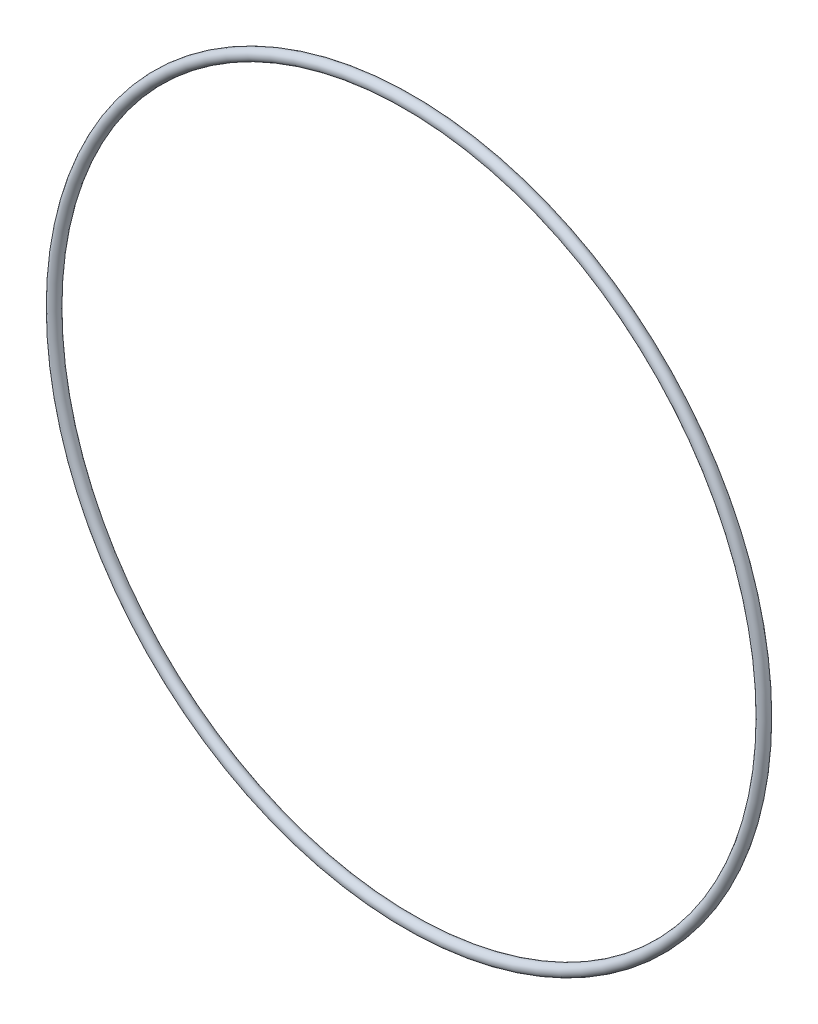
ISO-10303-21;
HEADER;
FILE_DESCRIPTION(('STEP AP214'),'2;1');
FILE_NAME('part.step','',(''),(''),'','','');
FILE_SCHEMA(('AUTOMOTIVE_DESIGN { 1 0 10303 214 1 1 1 1 }'));
ENDSEC;
DATA;
#1=APPLICATION_CONTEXT('core data for automotive mechanical design processes');
#2=APPLICATION_PROTOCOL_DEFINITION('international standard','automotive_design',2000,#1);
#3=PRODUCT_CONTEXT('',#1,'mechanical');
#4=PRODUCT('Part','Part','',(#3));
#5=PRODUCT_RELATED_PRODUCT_CATEGORY('part','',(#4));
#6=PRODUCT_DEFINITION_FORMATION('','',#4);
#7=PRODUCT_DEFINITION_CONTEXT('part definition',#1,'design');
#8=PRODUCT_DEFINITION('design','',#6,#7);
#9=PRODUCT_DEFINITION_SHAPE('','',#8);
#10=(LENGTH_UNIT() NAMED_UNIT(*) SI_UNIT(.MILLI.,.METRE.));
#11=(NAMED_UNIT(*) PLANE_ANGLE_UNIT() SI_UNIT($,.RADIAN.));
#12=(NAMED_UNIT(*) SI_UNIT($,.STERADIAN.) SOLID_ANGLE_UNIT());
#13=UNCERTAINTY_MEASURE_WITH_UNIT(LENGTH_MEASURE(1.E-05),#10,'distance_accuracy_value','');
#14=(GEOMETRIC_REPRESENTATION_CONTEXT(3) GLOBAL_UNCERTAINTY_ASSIGNED_CONTEXT((#13)) GLOBAL_UNIT_ASSIGNED_CONTEXT((#10,
#11,#12)) REPRESENTATION_CONTEXT('',''));
#15=CARTESIAN_POINT('',(0.,0.,0.));
#16=DIRECTION('',(0.,0.,1.));
#17=DIRECTION('',(1.,0.,0.));
#18=AXIS2_PLACEMENT_3D('',#15,#16,#17);
#19=CARTESIAN_POINT('',(0.,0.,0.));
#20=DIRECTION('',(0.,0.,1.));
#21=DIRECTION('',(1.,0.,0.));
#22=AXIS2_PLACEMENT_3D('',#19,#20,#21);
#23=TOROIDAL_SURFACE('',#22,83.693,1.30810000000001);
#24=CARTESIAN_POINT('',(85.0011,0.,0.));
#25=VERTEX_POINT('',#24);
#26=VERTEX_LOOP('',#25);
#27=FACE_BOUND('',#26,.T.);
#28=ADVANCED_FACE('F28',(#27),#23,.T.);
#29=CLOSED_SHELL('',(#28));
#30=MANIFOLD_SOLID_BREP('B2',#29);
#31=ADVANCED_BREP_SHAPE_REPRESENTATION('',(#18,#30),#14);
#32=SHAPE_DEFINITION_REPRESENTATION(#9,#31);
ENDSEC;
END-ISO-10303-21;
